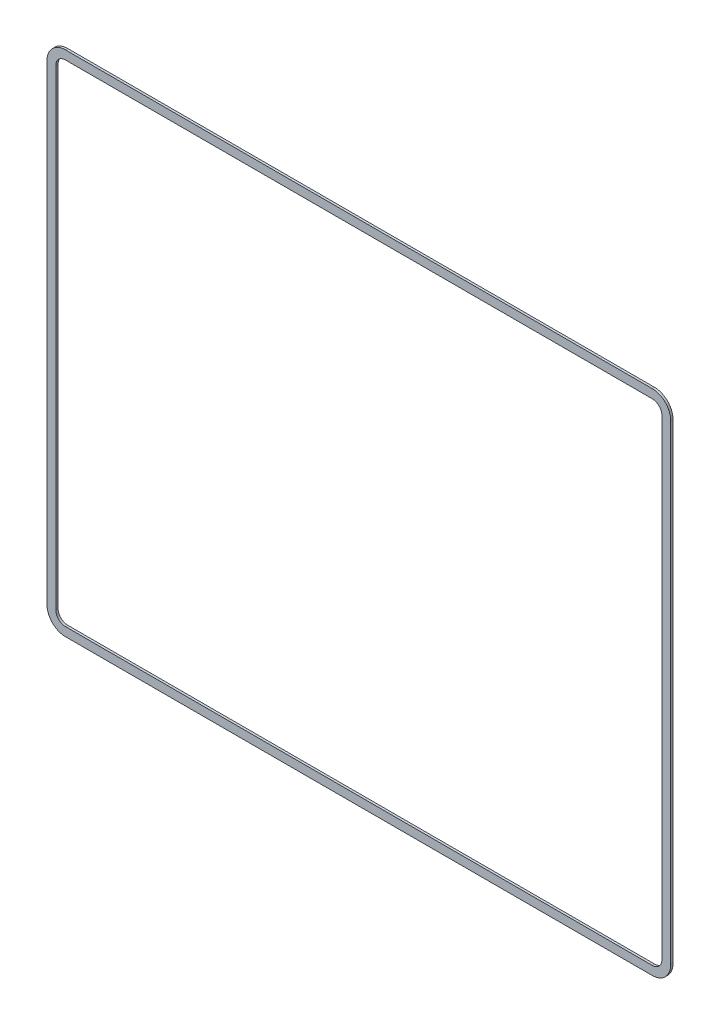
ISO-10303-21;
HEADER;
FILE_DESCRIPTION(('STEP AP214'),'2;1');
FILE_NAME('part.step','',(''),(''),'','','');
FILE_SCHEMA(('AUTOMOTIVE_DESIGN { 1 0 10303 214 1 1 1 1 }'));
ENDSEC;
DATA;
#1=APPLICATION_CONTEXT('core data for automotive mechanical design processes');
#2=APPLICATION_PROTOCOL_DEFINITION('international standard','automotive_design',2000,#1);
#3=PRODUCT_CONTEXT('',#1,'mechanical');
#4=PRODUCT('Part','Part','',(#3));
#5=PRODUCT_RELATED_PRODUCT_CATEGORY('part','',(#4));
#6=PRODUCT_DEFINITION_FORMATION('','',#4);
#7=PRODUCT_DEFINITION_CONTEXT('part definition',#1,'design');
#8=PRODUCT_DEFINITION('design','',#6,#7);
#9=PRODUCT_DEFINITION_SHAPE('','',#8);
#10=(LENGTH_UNIT() NAMED_UNIT(*) SI_UNIT(.MILLI.,.METRE.));
#11=(NAMED_UNIT(*) PLANE_ANGLE_UNIT() SI_UNIT($,.RADIAN.));
#12=(NAMED_UNIT(*) SI_UNIT($,.STERADIAN.) SOLID_ANGLE_UNIT());
#13=UNCERTAINTY_MEASURE_WITH_UNIT(LENGTH_MEASURE(1.E-05),#10,'distance_accuracy_value','');
#14=(GEOMETRIC_REPRESENTATION_CONTEXT(3) GLOBAL_UNCERTAINTY_ASSIGNED_CONTEXT((#13)) GLOBAL_UNIT_ASSIGNED_CONTEXT((#10,
#11,#12)) REPRESENTATION_CONTEXT('',''));
#15=CARTESIAN_POINT('',(0.,0.,0.));
#16=DIRECTION('',(0.,0.,1.));
#17=DIRECTION('',(1.,0.,0.));
#18=AXIS2_PLACEMENT_3D('',#15,#16,#17);
#19=CARTESIAN_POINT('',(-63.5,-51.,0.5));
#20=DIRECTION('',(0.,0.,-1.));
#21=DIRECTION('',(-1.,0.,0.));
#22=AXIS2_PLACEMENT_3D('',#19,#20,#21);
#23=PLANE('',#22);
#24=CARTESIAN_POINT('',(-63.5,-51.,0.5));
#25=DIRECTION('',(0.,0.,1.));
#26=DIRECTION('',(-1.,0.,0.));
#27=AXIS2_PLACEMENT_3D('',#24,#25,#26);
#28=CIRCLE('',#27,4.);
#29=CARTESIAN_POINT('',(-67.5,-51.,0.5));
#30=VERTEX_POINT('',#29);
#31=CARTESIAN_POINT('',(-63.5,-55.,0.5));
#32=VERTEX_POINT('',#31);
#33=EDGE_CURVE('E219',#30,#32,#28,.T.);
#34=ORIENTED_EDGE('',*,*,#33,.T.);
#35=DIRECTION('',(1.,0.,0.));
#36=VECTOR('',#35,1.);
#37=CARTESIAN_POINT('',(63.5,-55.,0.5));
#38=LINE('',#37,#36);
#39=CARTESIAN_POINT('',(63.5,-55.,0.5));
#40=VERTEX_POINT('',#39);
#41=EDGE_CURVE('E222',#32,#40,#38,.T.);
#42=ORIENTED_EDGE('',*,*,#41,.T.);
#43=CARTESIAN_POINT('',(63.5,-51.,0.5));
#44=DIRECTION('',(0.,0.,1.));
#45=DIRECTION('',(1.,0.,0.));
#46=AXIS2_PLACEMENT_3D('',#43,#44,#45);
#47=CIRCLE('',#46,4.);
#48=CARTESIAN_POINT('',(67.5,-51.,0.5));
#49=VERTEX_POINT('',#48);
#50=EDGE_CURVE('E225',#40,#49,#47,.T.);
#51=ORIENTED_EDGE('',*,*,#50,.T.);
#52=DIRECTION('',(0.,1.,0.));
#53=VECTOR('',#52,1.);
#54=CARTESIAN_POINT('',(67.5,-51.,0.5));
#55=LINE('',#54,#53);
#56=CARTESIAN_POINT('',(67.5,51.,0.5));
#57=VERTEX_POINT('',#56);
#58=EDGE_CURVE('E227',#49,#57,#55,.T.);
#59=ORIENTED_EDGE('',*,*,#58,.T.);
#60=CARTESIAN_POINT('',(63.5,51.,0.5));
#61=DIRECTION('',(0.,0.,1.));
#62=DIRECTION('',(1.,0.,0.));
#63=AXIS2_PLACEMENT_3D('',#60,#61,#62);
#64=CIRCLE('',#63,4.);
#65=CARTESIAN_POINT('',(63.5,55.,0.5));
#66=VERTEX_POINT('',#65);
#67=EDGE_CURVE('E229',#57,#66,#64,.T.);
#68=ORIENTED_EDGE('',*,*,#67,.T.);
#69=DIRECTION('',(-1.,0.,0.));
#70=VECTOR('',#69,1.);
#71=CARTESIAN_POINT('',(63.5,55.,0.5));
#72=LINE('',#71,#70);
#73=CARTESIAN_POINT('',(-63.5,55.,0.5));
#74=VERTEX_POINT('',#73);
#75=EDGE_CURVE('E231',#66,#74,#72,.T.);
#76=ORIENTED_EDGE('',*,*,#75,.T.);
#77=CARTESIAN_POINT('',(-63.5,51.,0.5));
#78=DIRECTION('',(0.,0.,1.));
#79=DIRECTION('',(1.,0.,0.));
#80=AXIS2_PLACEMENT_3D('',#77,#78,#79);
#81=CIRCLE('',#80,4.);
#82=CARTESIAN_POINT('',(-67.5,51.,0.5));
#83=VERTEX_POINT('',#82);
#84=EDGE_CURVE('E233',#74,#83,#81,.T.);
#85=ORIENTED_EDGE('',*,*,#84,.T.);
#86=DIRECTION('',(0.,-1.,0.));
#87=VECTOR('',#86,1.);
#88=CARTESIAN_POINT('',(-67.5,-51.,0.5));
#89=LINE('',#88,#87);
#90=EDGE_CURVE('E235',#83,#30,#89,.T.);
#91=ORIENTED_EDGE('',*,*,#90,.T.);
#92=EDGE_LOOP('',(#34,#42,#51,#59,#68,#76,#85,#91));
#93=FACE_BOUND('',#92,.T.);
#94=CARTESIAN_POINT('',(63.5,-51.,0.5));
#95=DIRECTION('',(0.,0.,1.));
#96=DIRECTION('',(1.,0.,0.));
#97=AXIS2_PLACEMENT_3D('',#94,#95,#96);
#98=CIRCLE('',#97,2.1);
#99=CARTESIAN_POINT('',(63.4999999999999,-53.1,0.5));
#100=VERTEX_POINT('',#99);
#101=CARTESIAN_POINT('',(65.6,-51.,0.5));
#102=VERTEX_POINT('',#101);
#103=EDGE_CURVE('E154',#100,#102,#98,.T.);
#104=ORIENTED_EDGE('',*,*,#103,.F.);
#105=DIRECTION('',(1.,0.,0.));
#106=VECTOR('',#105,1.);
#107=CARTESIAN_POINT('',(63.4999999999999,-53.1,0.5));
#108=LINE('',#107,#106);
#109=CARTESIAN_POINT('',(-63.5,-53.1,0.5));
#110=VERTEX_POINT('',#109);
#111=EDGE_CURVE('E187',#110,#100,#108,.T.);
#112=ORIENTED_EDGE('',*,*,#111,.F.);
#113=CARTESIAN_POINT('',(-63.5,-51.,0.5));
#114=DIRECTION('',(0.,0.,1.));
#115=DIRECTION('',(-1.,0.,0.));
#116=AXIS2_PLACEMENT_3D('',#113,#114,#115);
#117=CIRCLE('',#116,2.1);
#118=CARTESIAN_POINT('',(-65.6,-51.,0.5));
#119=VERTEX_POINT('',#118);
#120=EDGE_CURVE('E185',#119,#110,#117,.T.);
#121=ORIENTED_EDGE('',*,*,#120,.F.);
#122=DIRECTION('',(0.,-1.,0.));
#123=VECTOR('',#122,1.);
#124=CARTESIAN_POINT('',(-65.6,-51.,0.5));
#125=LINE('',#124,#123);
#126=CARTESIAN_POINT('',(-65.6,51.,0.5));
#127=VERTEX_POINT('',#126);
#128=EDGE_CURVE('E183',#127,#119,#125,.T.);
#129=ORIENTED_EDGE('',*,*,#128,.F.);
#130=CARTESIAN_POINT('',(-63.5,51.,0.5));
#131=DIRECTION('',(0.,0.,1.));
#132=DIRECTION('',(1.,0.,0.));
#133=AXIS2_PLACEMENT_3D('',#130,#131,#132);
#134=CIRCLE('',#133,2.1);
#135=CARTESIAN_POINT('',(-63.4999999999999,53.1,0.5));
#136=VERTEX_POINT('',#135);
#137=EDGE_CURVE('E181',#136,#127,#134,.T.);
#138=ORIENTED_EDGE('',*,*,#137,.F.);
#139=DIRECTION('',(-1.,0.,0.));
#140=VECTOR('',#139,1.);
#141=CARTESIAN_POINT('',(63.5,53.1,0.5));
#142=LINE('',#141,#140);
#143=CARTESIAN_POINT('',(63.5,53.1,0.5));
#144=VERTEX_POINT('',#143);
#145=EDGE_CURVE('E177',#144,#136,#142,.T.);
#146=ORIENTED_EDGE('',*,*,#145,.F.);
#147=CARTESIAN_POINT('',(63.5,51.,0.5));
#148=DIRECTION('',(0.,0.,1.));
#149=DIRECTION('',(1.,0.,0.));
#150=AXIS2_PLACEMENT_3D('',#147,#148,#149);
#151=CIRCLE('',#150,2.09999999999999);
#152=CARTESIAN_POINT('',(65.6,51.,0.5));
#153=VERTEX_POINT('',#152);
#154=EDGE_CURVE('E175',#153,#144,#151,.T.);
#155=ORIENTED_EDGE('',*,*,#154,.F.);
#156=DIRECTION('',(0.,1.,0.));
#157=VECTOR('',#156,1.);
#158=CARTESIAN_POINT('',(65.6,-51.,0.5));
#159=LINE('',#158,#157);
#160=EDGE_CURVE('E162',#102,#153,#159,.T.);
#161=ORIENTED_EDGE('',*,*,#160,.F.);
#162=EDGE_LOOP('',(#104,#112,#121,#129,#138,#146,#155,#161));
#163=FACE_BOUND('',#162,.T.);
#164=ADVANCED_FACE('F41',(#93,#163),#23,.F.);
#165=CARTESIAN_POINT('',(-63.5,-51.,0.));
#166=DIRECTION('',(0.,0.,-1.));
#167=DIRECTION('',(-1.,0.,0.));
#168=AXIS2_PLACEMENT_3D('',#165,#166,#167);
#169=PLANE('',#168);
#170=CARTESIAN_POINT('',(-63.5,-51.,0.));
#171=DIRECTION('',(0.,0.,1.));
#172=DIRECTION('',(-1.,0.,0.));
#173=AXIS2_PLACEMENT_3D('',#170,#171,#172);
#174=CIRCLE('',#173,4.);
#175=CARTESIAN_POINT('',(-67.5,-51.,0.));
#176=VERTEX_POINT('',#175);
#177=CARTESIAN_POINT('',(-63.5,-55.,0.));
#178=VERTEX_POINT('',#177);
#179=EDGE_CURVE('E170',#176,#178,#174,.T.);
#180=ORIENTED_EDGE('',*,*,#179,.F.);
#181=DIRECTION('',(0.,-1.,0.));
#182=VECTOR('',#181,1.);
#183=CARTESIAN_POINT('',(-67.5,-51.,0.));
#184=LINE('',#183,#182);
#185=CARTESIAN_POINT('',(-67.5,51.,0.));
#186=VERTEX_POINT('',#185);
#187=EDGE_CURVE('E223',#186,#176,#184,.T.);
#188=ORIENTED_EDGE('',*,*,#187,.F.);
#189=CARTESIAN_POINT('',(-63.5,51.,0.));
#190=DIRECTION('',(0.,0.,1.));
#191=DIRECTION('',(1.,0.,0.));
#192=AXIS2_PLACEMENT_3D('',#189,#190,#191);
#193=CIRCLE('',#192,4.);
#194=CARTESIAN_POINT('',(-63.5,55.,0.));
#195=VERTEX_POINT('',#194);
#196=EDGE_CURVE('E250',#195,#186,#193,.T.);
#197=ORIENTED_EDGE('',*,*,#196,.F.);
#198=DIRECTION('',(-1.,0.,0.));
#199=VECTOR('',#198,1.);
#200=CARTESIAN_POINT('',(63.5,55.,0.));
#201=LINE('',#200,#199);
#202=CARTESIAN_POINT('',(63.5,55.,0.));
#203=VERTEX_POINT('',#202);
#204=EDGE_CURVE('E248',#203,#195,#201,.T.);
#205=ORIENTED_EDGE('',*,*,#204,.F.);
#206=CARTESIAN_POINT('',(63.5,51.,0.));
#207=DIRECTION('',(0.,0.,1.));
#208=DIRECTION('',(1.,0.,0.));
#209=AXIS2_PLACEMENT_3D('',#206,#207,#208);
#210=CIRCLE('',#209,4.);
#211=CARTESIAN_POINT('',(67.5,51.,0.));
#212=VERTEX_POINT('',#211);
#213=EDGE_CURVE('E246',#212,#203,#210,.T.);
#214=ORIENTED_EDGE('',*,*,#213,.F.);
#215=DIRECTION('',(0.,1.,0.));
#216=VECTOR('',#215,1.);
#217=CARTESIAN_POINT('',(67.5,-51.,0.));
#218=LINE('',#217,#216);
#219=CARTESIAN_POINT('',(67.5,-51.,0.));
#220=VERTEX_POINT('',#219);
#221=EDGE_CURVE('E244',#220,#212,#218,.T.);
#222=ORIENTED_EDGE('',*,*,#221,.F.);
#223=CARTESIAN_POINT('',(63.5,-51.,0.));
#224=DIRECTION('',(0.,0.,1.));
#225=DIRECTION('',(1.,0.,0.));
#226=AXIS2_PLACEMENT_3D('',#223,#224,#225);
#227=CIRCLE('',#226,4.);
#228=CARTESIAN_POINT('',(63.5,-55.,0.));
#229=VERTEX_POINT('',#228);
#230=EDGE_CURVE('E242',#229,#220,#227,.T.);
#231=ORIENTED_EDGE('',*,*,#230,.F.);
#232=DIRECTION('',(1.,0.,0.));
#233=VECTOR('',#232,1.);
#234=CARTESIAN_POINT('',(63.5,-55.,0.));
#235=LINE('',#234,#233);
#236=EDGE_CURVE('E240',#178,#229,#235,.T.);
#237=ORIENTED_EDGE('',*,*,#236,.F.);
#238=EDGE_LOOP('',(#180,#188,#197,#205,#214,#222,#231,#237));
#239=FACE_BOUND('',#238,.T.);
#240=DIRECTION('',(1.,0.,0.));
#241=VECTOR('',#240,1.);
#242=CARTESIAN_POINT('',(63.4999999999999,-53.1,0.));
#243=LINE('',#242,#241);
#244=CARTESIAN_POINT('',(-63.5,-53.1,0.));
#245=VERTEX_POINT('',#244);
#246=CARTESIAN_POINT('',(63.4999999999999,-53.1,0.));
#247=VERTEX_POINT('',#246);
#248=EDGE_CURVE('E163',#245,#247,#243,.T.);
#249=ORIENTED_EDGE('',*,*,#248,.T.);
#250=CARTESIAN_POINT('',(63.5,-51.,0.));
#251=DIRECTION('',(0.,0.,1.));
#252=DIRECTION('',(1.,0.,0.));
#253=AXIS2_PLACEMENT_3D('',#250,#251,#252);
#254=CIRCLE('',#253,2.1);
#255=CARTESIAN_POINT('',(65.6,-51.,0.));
#256=VERTEX_POINT('',#255);
#257=EDGE_CURVE('E64',#247,#256,#254,.T.);
#258=ORIENTED_EDGE('',*,*,#257,.T.);
#259=DIRECTION('',(0.,1.,0.));
#260=VECTOR('',#259,1.);
#261=CARTESIAN_POINT('',(65.6,-51.,0.));
#262=LINE('',#261,#260);
#263=CARTESIAN_POINT('',(65.6,51.,0.));
#264=VERTEX_POINT('',#263);
#265=EDGE_CURVE('E169',#256,#264,#262,.T.);
#266=ORIENTED_EDGE('',*,*,#265,.T.);
#267=CARTESIAN_POINT('',(63.5,51.,0.));
#268=DIRECTION('',(0.,0.,1.));
#269=DIRECTION('',(1.,0.,0.));
#270=AXIS2_PLACEMENT_3D('',#267,#268,#269);
#271=CIRCLE('',#270,2.09999999999999);
#272=CARTESIAN_POINT('',(63.5,53.1,0.));
#273=VERTEX_POINT('',#272);
#274=EDGE_CURVE('E191',#264,#273,#271,.T.);
#275=ORIENTED_EDGE('',*,*,#274,.T.);
#276=DIRECTION('',(-1.,0.,0.));
#277=VECTOR('',#276,1.);
#278=CARTESIAN_POINT('',(63.5,53.1,0.));
#279=LINE('',#278,#277);
#280=CARTESIAN_POINT('',(-63.4999999999999,53.1,0.));
#281=VERTEX_POINT('',#280);
#282=EDGE_CURVE('E194',#273,#281,#279,.T.);
#283=ORIENTED_EDGE('',*,*,#282,.T.);
#284=CARTESIAN_POINT('',(-63.5,51.,0.));
#285=DIRECTION('',(0.,0.,1.));
#286=DIRECTION('',(1.,0.,0.));
#287=AXIS2_PLACEMENT_3D('',#284,#285,#286);
#288=CIRCLE('',#287,2.1);
#289=CARTESIAN_POINT('',(-65.6,51.,0.));
#290=VERTEX_POINT('',#289);
#291=EDGE_CURVE('E197',#281,#290,#288,.T.);
#292=ORIENTED_EDGE('',*,*,#291,.T.);
#293=DIRECTION('',(0.,-1.,0.));
#294=VECTOR('',#293,1.);
#295=CARTESIAN_POINT('',(-65.6,-51.,0.));
#296=LINE('',#295,#294);
#297=CARTESIAN_POINT('',(-65.6,-51.,0.));
#298=VERTEX_POINT('',#297);
#299=EDGE_CURVE('E200',#290,#298,#296,.T.);
#300=ORIENTED_EDGE('',*,*,#299,.T.);
#301=CARTESIAN_POINT('',(-63.5,-51.,0.));
#302=DIRECTION('',(0.,0.,1.));
#303=DIRECTION('',(-1.,0.,0.));
#304=AXIS2_PLACEMENT_3D('',#301,#302,#303);
#305=CIRCLE('',#304,2.1);
#306=EDGE_CURVE('E203',#298,#245,#305,.T.);
#307=ORIENTED_EDGE('',*,*,#306,.T.);
#308=EDGE_LOOP('',(#249,#258,#266,#275,#283,#292,#300,#307));
#309=FACE_BOUND('',#308,.T.);
#310=ADVANCED_FACE('F280',(#239,#309),#169,.T.);
#311=CARTESIAN_POINT('',(-63.5,-51.,0.5));
#312=DIRECTION('',(0.,0.,-1.));
#313=DIRECTION('',(-1.,0.,0.));
#314=AXIS2_PLACEMENT_3D('',#311,#312,#313);
#315=CYLINDRICAL_SURFACE('',#314,4.);
#316=ORIENTED_EDGE('',*,*,#179,.T.);
#317=DIRECTION('',(0.,0.,-1.));
#318=VECTOR('',#317,1.);
#319=CARTESIAN_POINT('',(-63.5,-55.,0.5));
#320=LINE('',#319,#318);
#321=EDGE_CURVE('E11',#32,#178,#320,.T.);
#322=ORIENTED_EDGE('',*,*,#321,.F.);
#323=ORIENTED_EDGE('',*,*,#33,.F.);
#324=DIRECTION('',(0.,0.,-1.));
#325=VECTOR('',#324,1.);
#326=CARTESIAN_POINT('',(-67.5,-51.,0.5));
#327=LINE('',#326,#325);
#328=EDGE_CURVE('E237',#30,#176,#327,.T.);
#329=ORIENTED_EDGE('',*,*,#328,.T.);
#330=EDGE_LOOP('',(#316,#322,#323,#329));
#331=FACE_BOUND('',#330,.T.);
#332=ADVANCED_FACE('F43',(#331),#315,.T.);
#333=CARTESIAN_POINT('',(63.5,-55.,0.5));
#334=DIRECTION('',(0.,1.,0.));
#335=DIRECTION('',(0.,0.,1.));
#336=AXIS2_PLACEMENT_3D('',#333,#334,#335);
#337=PLANE('',#336);
#338=ORIENTED_EDGE('',*,*,#236,.T.);
#339=DIRECTION('',(0.,0.,-1.));
#340=VECTOR('',#339,1.);
#341=CARTESIAN_POINT('',(63.5,-55.,0.5));
#342=LINE('',#341,#340);
#343=EDGE_CURVE('E49',#40,#229,#342,.T.);
#344=ORIENTED_EDGE('',*,*,#343,.F.);
#345=ORIENTED_EDGE('',*,*,#41,.F.);
#346=ORIENTED_EDGE('',*,*,#321,.T.);
#347=EDGE_LOOP('',(#338,#344,#345,#346));
#348=FACE_BOUND('',#347,.T.);
#349=ADVANCED_FACE('F297',(#348),#337,.F.);
#350=CARTESIAN_POINT('',(63.5,-51.,0.5));
#351=DIRECTION('',(0.,0.,-1.));
#352=DIRECTION('',(-1.,0.,0.));
#353=AXIS2_PLACEMENT_3D('',#350,#351,#352);
#354=CYLINDRICAL_SURFACE('',#353,4.);
#355=ORIENTED_EDGE('',*,*,#230,.T.);
#356=DIRECTION('',(0.,0.,-1.));
#357=VECTOR('',#356,1.);
#358=CARTESIAN_POINT('',(67.5,-51.,0.5));
#359=LINE('',#358,#357);
#360=EDGE_CURVE('E267',#49,#220,#359,.T.);
#361=ORIENTED_EDGE('',*,*,#360,.F.);
#362=ORIENTED_EDGE('',*,*,#50,.F.);
#363=ORIENTED_EDGE('',*,*,#343,.T.);
#364=EDGE_LOOP('',(#355,#361,#362,#363));
#365=FACE_BOUND('',#364,.T.);
#366=ADVANCED_FACE('F274',(#365),#354,.T.);
#367=CARTESIAN_POINT('',(67.5,-51.,0.5));
#368=DIRECTION('',(-1.,0.,0.));
#369=DIRECTION('',(0.,0.,1.));
#370=AXIS2_PLACEMENT_3D('',#367,#368,#369);
#371=PLANE('',#370);
#372=ORIENTED_EDGE('',*,*,#221,.T.);
#373=DIRECTION('',(0.,0.,-1.));
#374=VECTOR('',#373,1.);
#375=CARTESIAN_POINT('',(67.5,51.,0.5));
#376=LINE('',#375,#374);
#377=EDGE_CURVE('E264',#57,#212,#376,.T.);
#378=ORIENTED_EDGE('',*,*,#377,.F.);
#379=ORIENTED_EDGE('',*,*,#58,.F.);
#380=ORIENTED_EDGE('',*,*,#360,.T.);
#381=EDGE_LOOP('',(#372,#378,#379,#380));
#382=FACE_BOUND('',#381,.T.);
#383=ADVANCED_FACE('F286',(#382),#371,.F.);
#384=CARTESIAN_POINT('',(63.5,51.,0.5));
#385=DIRECTION('',(0.,0.,-1.));
#386=DIRECTION('',(-1.,0.,0.));
#387=AXIS2_PLACEMENT_3D('',#384,#385,#386);
#388=CYLINDRICAL_SURFACE('',#387,4.);
#389=ORIENTED_EDGE('',*,*,#213,.T.);
#390=DIRECTION('',(0.,0.,-1.));
#391=VECTOR('',#390,1.);
#392=CARTESIAN_POINT('',(63.5,55.,0.5));
#393=LINE('',#392,#391);
#394=EDGE_CURVE('E261',#66,#203,#393,.T.);
#395=ORIENTED_EDGE('',*,*,#394,.F.);
#396=ORIENTED_EDGE('',*,*,#67,.F.);
#397=ORIENTED_EDGE('',*,*,#377,.T.);
#398=EDGE_LOOP('',(#389,#395,#396,#397));
#399=FACE_BOUND('',#398,.T.);
#400=ADVANCED_FACE('F290',(#399),#388,.T.);
#401=CARTESIAN_POINT('',(63.5,55.,0.5));
#402=DIRECTION('',(0.,-1.,0.));
#403=DIRECTION('',(0.,0.,-1.));
#404=AXIS2_PLACEMENT_3D('',#401,#402,#403);
#405=PLANE('',#404);
#406=ORIENTED_EDGE('',*,*,#204,.T.);
#407=DIRECTION('',(0.,0.,-1.));
#408=VECTOR('',#407,1.);
#409=CARTESIAN_POINT('',(-63.5,55.,0.5));
#410=LINE('',#409,#408);
#411=EDGE_CURVE('E258',#74,#195,#410,.T.);
#412=ORIENTED_EDGE('',*,*,#411,.F.);
#413=ORIENTED_EDGE('',*,*,#75,.F.);
#414=ORIENTED_EDGE('',*,*,#394,.T.);
#415=EDGE_LOOP('',(#406,#412,#413,#414));
#416=FACE_BOUND('',#415,.T.);
#417=ADVANCED_FACE('F310',(#416),#405,.F.);
#418=CARTESIAN_POINT('',(-63.5,51.,0.5));
#419=DIRECTION('',(0.,0.,-1.));
#420=DIRECTION('',(-1.,0.,0.));
#421=AXIS2_PLACEMENT_3D('',#418,#419,#420);
#422=CYLINDRICAL_SURFACE('',#421,4.);
#423=ORIENTED_EDGE('',*,*,#196,.T.);
#424=DIRECTION('',(0.,0.,-1.));
#425=VECTOR('',#424,1.);
#426=CARTESIAN_POINT('',(-67.5,51.,0.5));
#427=LINE('',#426,#425);
#428=EDGE_CURVE('E255',#83,#186,#427,.T.);
#429=ORIENTED_EDGE('',*,*,#428,.F.);
#430=ORIENTED_EDGE('',*,*,#84,.F.);
#431=ORIENTED_EDGE('',*,*,#411,.T.);
#432=EDGE_LOOP('',(#423,#429,#430,#431));
#433=FACE_BOUND('',#432,.T.);
#434=ADVANCED_FACE('F308',(#433),#422,.T.);
#435=CARTESIAN_POINT('',(-67.5,-51.,0.5));
#436=DIRECTION('',(1.,0.,0.));
#437=DIRECTION('',(0.,0.,-1.));
#438=AXIS2_PLACEMENT_3D('',#435,#436,#437);
#439=PLANE('',#438);
#440=ORIENTED_EDGE('',*,*,#187,.T.);
#441=ORIENTED_EDGE('',*,*,#328,.F.);
#442=ORIENTED_EDGE('',*,*,#90,.F.);
#443=ORIENTED_EDGE('',*,*,#428,.T.);
#444=EDGE_LOOP('',(#440,#441,#442,#443));
#445=FACE_BOUND('',#444,.T.);
#446=ADVANCED_FACE('F303',(#445),#439,.F.);
#447=CARTESIAN_POINT('',(63.5,-51.,0.5));
#448=DIRECTION('',(0.,0.,-1.));
#449=DIRECTION('',(-1.,0.,0.));
#450=AXIS2_PLACEMENT_3D('',#447,#448,#449);
#451=CYLINDRICAL_SURFACE('',#450,2.1);
#452=ORIENTED_EDGE('',*,*,#257,.F.);
#453=DIRECTION('',(0.,0.,-1.));
#454=VECTOR('',#453,1.);
#455=CARTESIAN_POINT('',(63.4999999999999,-53.1,0.5));
#456=LINE('',#455,#454);
#457=EDGE_CURVE('E158',#100,#247,#456,.T.);
#458=ORIENTED_EDGE('',*,*,#457,.F.);
#459=ORIENTED_EDGE('',*,*,#103,.T.);
#460=DIRECTION('',(0.,0.,-1.));
#461=VECTOR('',#460,1.);
#462=CARTESIAN_POINT('',(65.6,-51.,0.5));
#463=LINE('',#462,#461);
#464=EDGE_CURVE('E157',#102,#256,#463,.T.);
#465=ORIENTED_EDGE('',*,*,#464,.T.);
#466=EDGE_LOOP('',(#452,#458,#459,#465));
#467=FACE_BOUND('',#466,.T.);
#468=ADVANCED_FACE('F156',(#467),#451,.F.);
#469=CARTESIAN_POINT('',(65.6,-51.,0.5));
#470=DIRECTION('',(-1.,0.,0.));
#471=DIRECTION('',(0.,-1.,0.));
#472=AXIS2_PLACEMENT_3D('',#469,#470,#471);
#473=PLANE('',#472);
#474=ORIENTED_EDGE('',*,*,#265,.F.);
#475=ORIENTED_EDGE('',*,*,#464,.F.);
#476=ORIENTED_EDGE('',*,*,#160,.T.);
#477=DIRECTION('',(0.,0.,-1.));
#478=VECTOR('',#477,1.);
#479=CARTESIAN_POINT('',(65.6,51.,0.5));
#480=LINE('',#479,#478);
#481=EDGE_CURVE('E171',#153,#264,#480,.T.);
#482=ORIENTED_EDGE('',*,*,#481,.T.);
#483=EDGE_LOOP('',(#474,#475,#476,#482));
#484=FACE_BOUND('',#483,.T.);
#485=ADVANCED_FACE('F166',(#484),#473,.T.);
#486=CARTESIAN_POINT('',(63.5,51.,0.5));
#487=DIRECTION('',(0.,0.,-1.));
#488=DIRECTION('',(-1.,0.,0.));
#489=AXIS2_PLACEMENT_3D('',#486,#487,#488);
#490=CYLINDRICAL_SURFACE('',#489,2.09999999999999);
#491=ORIENTED_EDGE('',*,*,#274,.F.);
#492=ORIENTED_EDGE('',*,*,#481,.F.);
#493=ORIENTED_EDGE('',*,*,#154,.T.);
#494=DIRECTION('',(0.,0.,-1.));
#495=VECTOR('',#494,1.);
#496=CARTESIAN_POINT('',(63.5,53.1,0.5));
#497=LINE('',#496,#495);
#498=EDGE_CURVE('E216',#144,#273,#497,.T.);
#499=ORIENTED_EDGE('',*,*,#498,.T.);
#500=EDGE_LOOP('',(#491,#492,#493,#499));
#501=FACE_BOUND('',#500,.T.);
#502=ADVANCED_FACE('F335',(#501),#490,.F.);
#503=CARTESIAN_POINT('',(63.5,53.1,0.5));
#504=DIRECTION('',(0.,-1.,0.));
#505=DIRECTION('',(0.,0.,-1.));
#506=AXIS2_PLACEMENT_3D('',#503,#504,#505);
#507=PLANE('',#506);
#508=ORIENTED_EDGE('',*,*,#282,.F.);
#509=ORIENTED_EDGE('',*,*,#498,.F.);
#510=ORIENTED_EDGE('',*,*,#145,.T.);
#511=DIRECTION('',(0.,0.,-1.));
#512=VECTOR('',#511,1.);
#513=CARTESIAN_POINT('',(-63.4999999999999,53.1,0.5));
#514=LINE('',#513,#512);
#515=EDGE_CURVE('E214',#136,#281,#514,.T.);
#516=ORIENTED_EDGE('',*,*,#515,.T.);
#517=EDGE_LOOP('',(#508,#509,#510,#516));
#518=FACE_BOUND('',#517,.T.);
#519=ADVANCED_FACE('F339',(#518),#507,.T.);
#520=CARTESIAN_POINT('',(-63.5,51.,0.5));
#521=DIRECTION('',(0.,0.,-1.));
#522=DIRECTION('',(-1.,0.,0.));
#523=AXIS2_PLACEMENT_3D('',#520,#521,#522);
#524=CYLINDRICAL_SURFACE('',#523,2.1);
#525=ORIENTED_EDGE('',*,*,#291,.F.);
#526=ORIENTED_EDGE('',*,*,#515,.F.);
#527=ORIENTED_EDGE('',*,*,#137,.T.);
#528=DIRECTION('',(0.,0.,-1.));
#529=VECTOR('',#528,1.);
#530=CARTESIAN_POINT('',(-65.6,51.,0.5));
#531=LINE('',#530,#529);
#532=EDGE_CURVE('E212',#127,#290,#531,.T.);
#533=ORIENTED_EDGE('',*,*,#532,.T.);
#534=EDGE_LOOP('',(#525,#526,#527,#533));
#535=FACE_BOUND('',#534,.T.);
#536=ADVANCED_FACE('F345',(#535),#524,.F.);
#537=CARTESIAN_POINT('',(-65.6,-51.,0.5));
#538=DIRECTION('',(1.,0.,0.));
#539=DIRECTION('',(0.,0.,-1.));
#540=AXIS2_PLACEMENT_3D('',#537,#538,#539);
#541=PLANE('',#540);
#542=ORIENTED_EDGE('',*,*,#299,.F.);
#543=ORIENTED_EDGE('',*,*,#532,.F.);
#544=ORIENTED_EDGE('',*,*,#128,.T.);
#545=DIRECTION('',(0.,0.,-1.));
#546=VECTOR('',#545,1.);
#547=CARTESIAN_POINT('',(-65.6,-51.,0.5));
#548=LINE('',#547,#546);
#549=EDGE_CURVE('E210',#119,#298,#548,.T.);
#550=ORIENTED_EDGE('',*,*,#549,.T.);
#551=EDGE_LOOP('',(#542,#543,#544,#550));
#552=FACE_BOUND('',#551,.T.);
#553=ADVANCED_FACE('F349',(#552),#541,.T.);
#554=CARTESIAN_POINT('',(-63.5,-51.,0.5));
#555=DIRECTION('',(0.,0.,-1.));
#556=DIRECTION('',(-1.,0.,0.));
#557=AXIS2_PLACEMENT_3D('',#554,#555,#556);
#558=CYLINDRICAL_SURFACE('',#557,2.1);
#559=ORIENTED_EDGE('',*,*,#306,.F.);
#560=ORIENTED_EDGE('',*,*,#549,.F.);
#561=ORIENTED_EDGE('',*,*,#120,.T.);
#562=DIRECTION('',(0.,0.,-1.));
#563=VECTOR('',#562,1.);
#564=CARTESIAN_POINT('',(-63.5,-53.1,0.5));
#565=LINE('',#564,#563);
#566=EDGE_CURVE('E56',#110,#245,#565,.T.);
#567=ORIENTED_EDGE('',*,*,#566,.T.);
#568=EDGE_LOOP('',(#559,#560,#561,#567));
#569=FACE_BOUND('',#568,.T.);
#570=ADVANCED_FACE('F353',(#569),#558,.F.);
#571=CARTESIAN_POINT('',(63.4999999999999,-53.1,0.5));
#572=DIRECTION('',(0.,1.,0.));
#573=DIRECTION('',(-1.,0.,0.));
#574=AXIS2_PLACEMENT_3D('',#571,#572,#573);
#575=PLANE('',#574);
#576=ORIENTED_EDGE('',*,*,#248,.F.);
#577=ORIENTED_EDGE('',*,*,#566,.F.);
#578=ORIENTED_EDGE('',*,*,#111,.T.);
#579=ORIENTED_EDGE('',*,*,#457,.T.);
#580=EDGE_LOOP('',(#576,#577,#578,#579));
#581=FACE_BOUND('',#580,.T.);
#582=ADVANCED_FACE('F357',(#581),#575,.T.);
#583=CLOSED_SHELL('',(#164,#310,#332,#349,#366,#383,#400,#417,#434,#446,#468,#485,#502,#519,
#536,#553,#570,#582));
#584=MANIFOLD_SOLID_BREP('B2',#583);
#585=ADVANCED_BREP_SHAPE_REPRESENTATION('',(#18,#584),#14);
#586=SHAPE_DEFINITION_REPRESENTATION(#9,#585);
ENDSEC;
END-ISO-10303-21;
